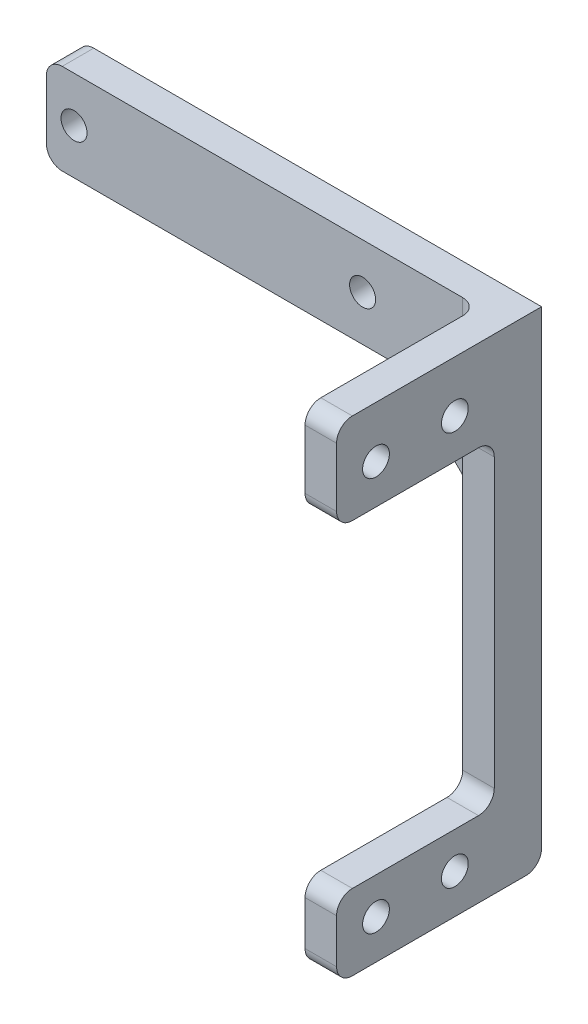
ISO-10303-21;
HEADER;
FILE_DESCRIPTION(('STEP AP214'),'2;1');
FILE_NAME('part.step','',(''),(''),'','','');
FILE_SCHEMA(('AUTOMOTIVE_DESIGN { 1 0 10303 214 1 1 1 1 }'));
ENDSEC;
DATA;
#1=APPLICATION_CONTEXT('core data for automotive mechanical design processes');
#2=APPLICATION_PROTOCOL_DEFINITION('international standard','automotive_design',2000,#1);
#3=PRODUCT_CONTEXT('',#1,'mechanical');
#4=PRODUCT('Part','Part','',(#3));
#5=PRODUCT_RELATED_PRODUCT_CATEGORY('part','',(#4));
#6=PRODUCT_DEFINITION_FORMATION('','',#4);
#7=PRODUCT_DEFINITION_CONTEXT('part definition',#1,'design');
#8=PRODUCT_DEFINITION('design','',#6,#7);
#9=PRODUCT_DEFINITION_SHAPE('','',#8);
#10=(LENGTH_UNIT() NAMED_UNIT(*) SI_UNIT(.MILLI.,.METRE.));
#11=(NAMED_UNIT(*) PLANE_ANGLE_UNIT() SI_UNIT($,.RADIAN.));
#12=(NAMED_UNIT(*) SI_UNIT($,.STERADIAN.) SOLID_ANGLE_UNIT());
#13=UNCERTAINTY_MEASURE_WITH_UNIT(LENGTH_MEASURE(1.E-05),#10,'distance_accuracy_value','');
#14=(GEOMETRIC_REPRESENTATION_CONTEXT(3) GLOBAL_UNCERTAINTY_ASSIGNED_CONTEXT((#13)) GLOBAL_UNIT_ASSIGNED_CONTEXT((#10,
#11,#12)) REPRESENTATION_CONTEXT('',''));
#15=CARTESIAN_POINT('',(0.,0.,0.));
#16=DIRECTION('',(0.,0.,1.));
#17=DIRECTION('',(1.,0.,0.));
#18=AXIS2_PLACEMENT_3D('',#15,#16,#17);
#19=CARTESIAN_POINT('',(54.8,11.5,4.));
#20=DIRECTION('',(1.,0.,0.));
#21=DIRECTION('',(0.,0.,-1.));
#22=AXIS2_PLACEMENT_3D('',#19,#20,#21);
#23=PLANE('',#22);
#24=CARTESIAN_POINT('',(54.8,5.,21.));
#25=DIRECTION('',(-1.,0.,0.));
#26=DIRECTION('',(0.,0.,1.));
#27=AXIS2_PLACEMENT_3D('',#24,#25,#26);
#28=CIRCLE('',#27,1.7);
#29=CARTESIAN_POINT('',(54.8,5.,22.7));
#30=VERTEX_POINT('',#29);
#31=EDGE_CURVE('E811',#30,#30,#28,.T.);
#32=ORIENTED_EDGE('',*,*,#31,.F.);
#33=EDGE_LOOP('',(#32));
#34=FACE_BOUND('',#33,.T.);
#35=CARTESIAN_POINT('',(54.8,5.,11.));
#36=DIRECTION('',(-1.,0.,0.));
#37=DIRECTION('',(0.,0.,1.));
#38=AXIS2_PLACEMENT_3D('',#35,#36,#37);
#39=CIRCLE('',#38,1.7);
#40=CARTESIAN_POINT('',(54.8,5.,12.7));
#41=VERTEX_POINT('',#40);
#42=EDGE_CURVE('E543',#41,#41,#39,.T.);
#43=ORIENTED_EDGE('',*,*,#42,.F.);
#44=EDGE_LOOP('',(#43));
#45=FACE_BOUND('',#44,.T.);
#46=DIRECTION('',(0.,0.,-1.));
#47=VECTOR('',#46,1.);
#48=CARTESIAN_POINT('',(54.8,0.,26.));
#49=LINE('',#48,#47);
#50=CARTESIAN_POINT('',(54.8,0.,24.));
#51=VERTEX_POINT('',#50);
#52=CARTESIAN_POINT('',(54.8,0.,8.));
#53=VERTEX_POINT('',#52);
#54=EDGE_CURVE('E437',#51,#53,#49,.T.);
#55=ORIENTED_EDGE('',*,*,#54,.F.);
#56=CARTESIAN_POINT('',(54.8,2.,24.));
#57=DIRECTION('',(1.,0.,0.));
#58=DIRECTION('',(0.,0.,-1.));
#59=AXIS2_PLACEMENT_3D('',#56,#57,#58);
#60=CIRCLE('',#59,2.);
#61=CARTESIAN_POINT('',(54.8,2.,26.));
#62=VERTEX_POINT('',#61);
#63=EDGE_CURVE('E290',#51,#62,#60,.F.);
#64=ORIENTED_EDGE('',*,*,#63,.T.);
#65=DIRECTION('',(0.,-1.,0.));
#66=VECTOR('',#65,1.);
#67=CARTESIAN_POINT('',(54.8,11.5,26.));
#68=LINE('',#67,#66);
#69=CARTESIAN_POINT('',(54.8,9.5,26.));
#70=VERTEX_POINT('',#69);
#71=EDGE_CURVE('E228',#70,#62,#68,.T.);
#72=ORIENTED_EDGE('',*,*,#71,.F.);
#73=CARTESIAN_POINT('',(54.8,9.5,24.));
#74=DIRECTION('',(1.,0.,0.));
#75=DIRECTION('',(0.,0.,-1.));
#76=AXIS2_PLACEMENT_3D('',#73,#74,#75);
#77=CIRCLE('',#76,2.);
#78=CARTESIAN_POINT('',(54.8,11.5,24.));
#79=VERTEX_POINT('',#78);
#80=EDGE_CURVE('E288',#70,#79,#77,.F.);
#81=ORIENTED_EDGE('',*,*,#80,.T.);
#82=DIRECTION('',(0.,0.,1.));
#83=VECTOR('',#82,1.);
#84=CARTESIAN_POINT('',(54.8,11.5,4.));
#85=LINE('',#84,#83);
#86=CARTESIAN_POINT('',(54.8,11.5,6.));
#87=VERTEX_POINT('',#86);
#88=EDGE_CURVE('E234',#87,#79,#85,.T.);
#89=ORIENTED_EDGE('',*,*,#88,.F.);
#90=DIRECTION('',(0.,-1.,0.));
#91=VECTOR('',#90,1.);
#92=CARTESIAN_POINT('',(54.8,-10.0000000000001,6.));
#93=LINE('',#92,#91);
#94=CARTESIAN_POINT('',(54.8,-2.,6.));
#95=VERTEX_POINT('',#94);
#96=EDGE_CURVE('E248',#87,#95,#93,.T.);
#97=ORIENTED_EDGE('',*,*,#96,.T.);
#98=CARTESIAN_POINT('',(54.8,-2.,8.));
#99=DIRECTION('',(1.,0.,0.));
#100=DIRECTION('',(0.,0.,-1.));
#101=AXIS2_PLACEMENT_3D('',#98,#99,#100);
#102=CIRCLE('',#101,2.);
#103=EDGE_CURVE('E340',#95,#53,#102,.T.);
#104=ORIENTED_EDGE('',*,*,#103,.T.);
#105=EDGE_LOOP('',(#55,#64,#72,#81,#89,#97,#104));
#106=FACE_BOUND('',#105,.T.);
#107=ADVANCED_FACE('F35',(#34,#45,#106),#23,.F.);
#108=CARTESIAN_POINT('',(58.8,11.5,26.));
#109=DIRECTION('',(0.,0.,1.));
#110=DIRECTION('',(1.,0.,0.));
#111=AXIS2_PLACEMENT_3D('',#108,#109,#110);
#112=PLANE('',#111);
#113=CARTESIAN_POINT('',(54.8,-42.4,26.));
#114=VERTEX_POINT('',#113);
#115=CARTESIAN_POINT('',(54.8,-48.,26.));
#116=VERTEX_POINT('',#115);
#117=EDGE_CURVE('E239',#114,#116,#68,.T.);
#118=ORIENTED_EDGE('',*,*,#117,.T.);
#119=DIRECTION('',(-1.,0.,0.));
#120=VECTOR('',#119,1.);
#121=CARTESIAN_POINT('',(58.8,-48.,26.));
#122=LINE('',#121,#120);
#123=CARTESIAN_POINT('',(58.8,-48.,26.));
#124=VERTEX_POINT('',#123);
#125=EDGE_CURVE('E271',#116,#124,#122,.F.);
#126=ORIENTED_EDGE('',*,*,#125,.T.);
#127=DIRECTION('',(0.,-1.,0.));
#128=VECTOR('',#127,1.);
#129=CARTESIAN_POINT('',(58.8,11.5,26.));
#130=LINE('',#129,#128);
#131=CARTESIAN_POINT('',(58.8,-42.4,26.));
#132=VERTEX_POINT('',#131);
#133=EDGE_CURVE('E236',#132,#124,#130,.T.);
#134=ORIENTED_EDGE('',*,*,#133,.F.);
#135=DIRECTION('',(-1.,0.,0.));
#136=VECTOR('',#135,1.);
#137=CARTESIAN_POINT('',(54.8,-42.4,26.));
#138=LINE('',#137,#136);
#139=EDGE_CURVE('E268',#132,#114,#138,.T.);
#140=ORIENTED_EDGE('',*,*,#139,.T.);
#141=EDGE_LOOP('',(#118,#126,#134,#140));
#142=FACE_BOUND('',#141,.T.);
#143=ADVANCED_FACE('F487',(#142),#112,.T.);
#144=CARTESIAN_POINT('',(0.,0.,0.));
#145=DIRECTION('',(0.,1.,0.));
#146=DIRECTION('',(0.,0.,1.));
#147=AXIS2_PLACEMENT_3D('',#144,#145,#146);
#148=PLANE('',#147);
#149=DIRECTION('',(1.,0.,0.));
#150=VECTOR('',#149,1.);
#151=CARTESIAN_POINT('',(0.,0.,0.));
#152=LINE('',#151,#150);
#153=CARTESIAN_POINT('',(2.,0.,0.));
#154=VERTEX_POINT('',#153);
#155=CARTESIAN_POINT('',(43.9715728752538,0.,0.));
#156=VERTEX_POINT('',#155);
#157=EDGE_CURVE('E219',#154,#156,#152,.T.);
#158=ORIENTED_EDGE('',*,*,#157,.T.);
#159=DIRECTION('',(0.,0.,-1.));
#160=VECTOR('',#159,1.);
#161=CARTESIAN_POINT('',(43.9715728752538,0.,4.));
#162=LINE('',#161,#160);
#163=CARTESIAN_POINT('',(43.9715728752538,0.,4.));
#164=VERTEX_POINT('',#163);
#165=EDGE_CURVE('E306',#156,#164,#162,.F.);
#166=ORIENTED_EDGE('',*,*,#165,.T.);
#167=DIRECTION('',(1.,0.,0.));
#168=VECTOR('',#167,1.);
#169=CARTESIAN_POINT('',(0.,0.,4.));
#170=LINE('',#169,#168);
#171=CARTESIAN_POINT('',(2.,0.,4.));
#172=VERTEX_POINT('',#171);
#173=EDGE_CURVE('E216',#172,#164,#170,.T.);
#174=ORIENTED_EDGE('',*,*,#173,.F.);
#175=DIRECTION('',(0.,0.,1.));
#176=VECTOR('',#175,1.);
#177=CARTESIAN_POINT('',(2.,0.,0.));
#178=LINE('',#177,#176);
#179=EDGE_CURVE('E304',#172,#154,#178,.F.);
#180=ORIENTED_EDGE('',*,*,#179,.T.);
#181=EDGE_LOOP('',(#158,#166,#174,#180));
#182=FACE_BOUND('',#181,.T.);
#183=ADVANCED_FACE('F387',(#182),#148,.F.);
#184=CARTESIAN_POINT('',(0.,11.5,4.));
#185=DIRECTION('',(0.,0.,-1.));
#186=DIRECTION('',(-1.,0.,0.));
#187=AXIS2_PLACEMENT_3D('',#184,#185,#186);
#188=PLANE('',#187);
#189=CARTESIAN_POINT('',(40.1,5.75,4.));
#190=DIRECTION('',(0.,0.,-1.));
#191=DIRECTION('',(-1.,0.,0.));
#192=AXIS2_PLACEMENT_3D('',#189,#190,#191);
#193=CIRCLE('',#192,1.65);
#194=CARTESIAN_POINT('',(38.45,5.75,4.));
#195=VERTEX_POINT('',#194);
#196=EDGE_CURVE('E373',#195,#195,#193,.F.);
#197=ORIENTED_EDGE('',*,*,#196,.F.);
#198=EDGE_LOOP('',(#197));
#199=FACE_BOUND('',#198,.T.);
#200=CARTESIAN_POINT('',(3.5,5.75,4.));
#201=DIRECTION('',(0.,0.,-1.));
#202=DIRECTION('',(-1.,0.,0.));
#203=AXIS2_PLACEMENT_3D('',#200,#201,#202);
#204=CIRCLE('',#203,1.65);
#205=CARTESIAN_POINT('',(1.85,5.75,4.));
#206=VERTEX_POINT('',#205);
#207=EDGE_CURVE('E222',#206,#206,#204,.F.);
#208=ORIENTED_EDGE('',*,*,#207,.F.);
#209=EDGE_LOOP('',(#208));
#210=FACE_BOUND('',#209,.T.);
#211=DIRECTION('',(1.,0.,0.));
#212=VECTOR('',#211,1.);
#213=CARTESIAN_POINT('',(0.,11.5,4.));
#214=LINE('',#213,#212);
#215=CARTESIAN_POINT('',(2.,11.5,4.));
#216=VERTEX_POINT('',#215);
#217=CARTESIAN_POINT('',(52.8,11.5,4.));
#218=VERTEX_POINT('',#217);
#219=EDGE_CURVE('E203',#216,#218,#214,.T.);
#220=ORIENTED_EDGE('',*,*,#219,.F.);
#221=CARTESIAN_POINT('',(2.,9.5,4.));
#222=DIRECTION('',(0.,0.,-1.));
#223=DIRECTION('',(-1.,0.,0.));
#224=AXIS2_PLACEMENT_3D('',#221,#222,#223);
#225=CIRCLE('',#224,2.);
#226=CARTESIAN_POINT('',(0.,9.5,4.));
#227=VERTEX_POINT('',#226);
#228=EDGE_CURVE('E311',#216,#227,#225,.F.);
#229=ORIENTED_EDGE('',*,*,#228,.T.);
#230=DIRECTION('',(0.,-1.,0.));
#231=VECTOR('',#230,1.);
#232=CARTESIAN_POINT('',(0.,11.5,4.));
#233=LINE('',#232,#231);
#234=CARTESIAN_POINT('',(0.,2.,4.));
#235=VERTEX_POINT('',#234);
#236=EDGE_CURVE('E226',#227,#235,#233,.T.);
#237=ORIENTED_EDGE('',*,*,#236,.T.);
#238=CARTESIAN_POINT('',(2.,2.,4.));
#239=DIRECTION('',(0.,0.,-1.));
#240=DIRECTION('',(-1.,0.,0.));
#241=AXIS2_PLACEMENT_3D('',#238,#239,#240);
#242=CIRCLE('',#241,2.);
#243=EDGE_CURVE('E309',#235,#172,#242,.F.);
#244=ORIENTED_EDGE('',*,*,#243,.T.);
#245=ORIENTED_EDGE('',*,*,#173,.T.);
#246=CARTESIAN_POINT('',(43.9715728752538,-2.,4.));
#247=DIRECTION('',(0.,0.,-1.));
#248=DIRECTION('',(-1.,0.,0.));
#249=AXIS2_PLACEMENT_3D('',#246,#247,#248);
#250=CIRCLE('',#249,2.);
#251=CARTESIAN_POINT('',(45.385786437627,-0.585786437626915,4.));
#252=VERTEX_POINT('',#251);
#253=EDGE_CURVE('E326',#164,#252,#250,.T.);
#254=ORIENTED_EDGE('',*,*,#253,.T.);
#255=DIRECTION('',(-0.707106781186544,0.707106781186551,0.));
#256=VECTOR('',#255,1.);
#257=CARTESIAN_POINT('',(16.6500000000003,28.1500000000001,4.));
#258=LINE('',#257,#256);
#259=CARTESIAN_POINT('',(52.8,-8.00000000000004,4.));
#260=VERTEX_POINT('',#259);
#261=EDGE_CURVE('E245',#252,#260,#258,.F.);
#262=ORIENTED_EDGE('',*,*,#261,.T.);
#263=DIRECTION('',(0.,-1.,0.));
#264=VECTOR('',#263,1.);
#265=CARTESIAN_POINT('',(52.8,11.5,4.));
#266=LINE('',#265,#264);
#267=EDGE_CURVE('E250',#260,#218,#266,.F.);
#268=ORIENTED_EDGE('',*,*,#267,.T.);
#269=EDGE_LOOP('',(#220,#229,#237,#244,#245,#254,#262,#268));
#270=FACE_BOUND('',#269,.T.);
#271=ADVANCED_FACE('F384',(#199,#210,#270),#188,.F.);
#272=CARTESIAN_POINT('',(58.8,11.5,0.));
#273=DIRECTION('',(1.,0.,0.));
#274=DIRECTION('',(0.,0.,-1.));
#275=AXIS2_PLACEMENT_3D('',#272,#273,#274);
#276=PLANE('',#275);
#277=CARTESIAN_POINT('',(58.8,5.,11.));
#278=DIRECTION('',(1.,0.,0.));
#279=DIRECTION('',(0.,0.,-1.));
#280=AXIS2_PLACEMENT_3D('',#277,#278,#279);
#281=CIRCLE('',#280,1.7);
#282=CARTESIAN_POINT('',(58.8,5.,9.3));
#283=VERTEX_POINT('',#282);
#284=EDGE_CURVE('E525',#283,#283,#281,.F.);
#285=ORIENTED_EDGE('',*,*,#284,.T.);
#286=EDGE_LOOP('',(#285));
#287=FACE_BOUND('',#286,.T.);
#288=CARTESIAN_POINT('',(58.8,5.,21.));
#289=DIRECTION('',(1.,0.,0.));
#290=DIRECTION('',(0.,0.,-1.));
#291=AXIS2_PLACEMENT_3D('',#288,#289,#290);
#292=CIRCLE('',#291,1.7);
#293=CARTESIAN_POINT('',(58.8,5.,19.3));
#294=VERTEX_POINT('',#293);
#295=EDGE_CURVE('E529',#294,#294,#292,.F.);
#296=ORIENTED_EDGE('',*,*,#295,.T.);
#297=EDGE_LOOP('',(#296));
#298=FACE_BOUND('',#297,.T.);
#299=CARTESIAN_POINT('',(58.8,-45.,21.0000000000005));
#300=DIRECTION('',(1.,0.,0.));
#301=DIRECTION('',(0.,0.,-1.));
#302=AXIS2_PLACEMENT_3D('',#299,#300,#301);
#303=CIRCLE('',#302,1.7);
#304=CARTESIAN_POINT('',(58.8,-45.,19.3000000000005));
#305=VERTEX_POINT('',#304);
#306=EDGE_CURVE('E533',#305,#305,#303,.F.);
#307=ORIENTED_EDGE('',*,*,#306,.T.);
#308=EDGE_LOOP('',(#307));
#309=FACE_BOUND('',#308,.T.);
#310=CARTESIAN_POINT('',(58.8,-45.,11.0000000000005));
#311=DIRECTION('',(1.,0.,0.));
#312=DIRECTION('',(0.,0.,-1.));
#313=AXIS2_PLACEMENT_3D('',#310,#311,#312);
#314=CIRCLE('',#313,1.7);
#315=CARTESIAN_POINT('',(58.8,-45.,9.30000000000052));
#316=VERTEX_POINT('',#315);
#317=EDGE_CURVE('E536',#316,#316,#314,.F.);
#318=ORIENTED_EDGE('',*,*,#317,.T.);
#319=EDGE_LOOP('',(#318));
#320=FACE_BOUND('',#319,.T.);
#321=DIRECTION('',(0.,0.,1.));
#322=VECTOR('',#321,1.);
#323=CARTESIAN_POINT('',(58.8,-50.,26.));
#324=LINE('',#323,#322);
#325=CARTESIAN_POINT('',(58.8,-50.,2.00000000000001));
#326=VERTEX_POINT('',#325);
#327=CARTESIAN_POINT('',(58.8,-50.,24.));
#328=VERTEX_POINT('',#327);
#329=EDGE_CURVE('E355',#326,#328,#324,.T.);
#330=ORIENTED_EDGE('',*,*,#329,.F.);
#331=CARTESIAN_POINT('',(58.8,-48.,2.));
#332=DIRECTION('',(1.,0.,0.));
#333=DIRECTION('',(0.,0.,-1.));
#334=AXIS2_PLACEMENT_3D('',#331,#332,#333);
#335=CIRCLE('',#334,2.);
#336=CARTESIAN_POINT('',(58.8,-48.,0.));
#337=VERTEX_POINT('',#336);
#338=EDGE_CURVE('E57',#326,#337,#335,.T.);
#339=ORIENTED_EDGE('',*,*,#338,.T.);
#340=DIRECTION('',(0.,-1.,0.));
#341=VECTOR('',#340,1.);
#342=CARTESIAN_POINT('',(58.8,11.5,0.));
#343=LINE('',#342,#341);
#344=CARTESIAN_POINT('',(58.8,11.5,0.));
#345=VERTEX_POINT('',#344);
#346=EDGE_CURVE('E195',#345,#337,#343,.T.);
#347=ORIENTED_EDGE('',*,*,#346,.F.);
#348=DIRECTION('',(0.,0.,1.));
#349=VECTOR('',#348,1.);
#350=CARTESIAN_POINT('',(58.8,11.5,0.));
#351=LINE('',#350,#349);
#352=CARTESIAN_POINT('',(58.8,11.5,24.));
#353=VERTEX_POINT('',#352);
#354=EDGE_CURVE('E204',#345,#353,#351,.T.);
#355=ORIENTED_EDGE('',*,*,#354,.T.);
#356=CARTESIAN_POINT('',(58.8,9.5,24.));
#357=DIRECTION('',(1.,0.,0.));
#358=DIRECTION('',(0.,0.,-1.));
#359=AXIS2_PLACEMENT_3D('',#356,#357,#358);
#360=CIRCLE('',#359,2.);
#361=CARTESIAN_POINT('',(58.8,9.5,26.));
#362=VERTEX_POINT('',#361);
#363=EDGE_CURVE('E273',#353,#362,#360,.T.);
#364=ORIENTED_EDGE('',*,*,#363,.T.);
#365=CARTESIAN_POINT('',(58.8,2.,26.));
#366=VERTEX_POINT('',#365);
#367=EDGE_CURVE('E240',#362,#366,#130,.T.);
#368=ORIENTED_EDGE('',*,*,#367,.T.);
#369=CARTESIAN_POINT('',(58.8,2.,24.));
#370=DIRECTION('',(1.,0.,0.));
#371=DIRECTION('',(0.,0.,-1.));
#372=AXIS2_PLACEMENT_3D('',#369,#370,#371);
#373=CIRCLE('',#372,2.);
#374=CARTESIAN_POINT('',(58.8,0.,24.));
#375=VERTEX_POINT('',#374);
#376=EDGE_CURVE('E275',#366,#375,#373,.T.);
#377=ORIENTED_EDGE('',*,*,#376,.T.);
#378=DIRECTION('',(0.,0.,-1.));
#379=VECTOR('',#378,1.);
#380=CARTESIAN_POINT('',(58.8,0.,26.));
#381=LINE('',#380,#379);
#382=CARTESIAN_POINT('',(58.8,0.,8.));
#383=VERTEX_POINT('',#382);
#384=EDGE_CURVE('E367',#375,#383,#381,.T.);
#385=ORIENTED_EDGE('',*,*,#384,.T.);
#386=CARTESIAN_POINT('',(58.8,-2.,8.));
#387=DIRECTION('',(1.,0.,0.));
#388=DIRECTION('',(0.,0.,-1.));
#389=AXIS2_PLACEMENT_3D('',#386,#387,#388);
#390=CIRCLE('',#389,2.);
#391=CARTESIAN_POINT('',(58.8,-2.,6.));
#392=VERTEX_POINT('',#391);
#393=EDGE_CURVE('E342',#383,#392,#390,.F.);
#394=ORIENTED_EDGE('',*,*,#393,.T.);
#395=DIRECTION('',(0.,-1.,0.));
#396=VECTOR('',#395,1.);
#397=CARTESIAN_POINT('',(58.8,0.,6.));
#398=LINE('',#397,#396);
#399=CARTESIAN_POINT('',(58.8,-38.4,6.));
#400=VERTEX_POINT('',#399);
#401=EDGE_CURVE('E459',#392,#400,#398,.T.);
#402=ORIENTED_EDGE('',*,*,#401,.T.);
#403=CARTESIAN_POINT('',(58.8,-38.4,8.));
#404=DIRECTION('',(1.,0.,0.));
#405=DIRECTION('',(0.,0.,-1.));
#406=AXIS2_PLACEMENT_3D('',#403,#404,#405);
#407=CIRCLE('',#406,2.);
#408=CARTESIAN_POINT('',(58.8,-40.4,8.));
#409=VERTEX_POINT('',#408);
#410=EDGE_CURVE('E346',#400,#409,#407,.F.);
#411=ORIENTED_EDGE('',*,*,#410,.T.);
#412=DIRECTION('',(0.,0.,1.));
#413=VECTOR('',#412,1.);
#414=CARTESIAN_POINT('',(58.8,-40.4,26.));
#415=LINE('',#414,#413);
#416=CARTESIAN_POINT('',(58.8,-40.4,24.));
#417=VERTEX_POINT('',#416);
#418=EDGE_CURVE('E441',#409,#417,#415,.T.);
#419=ORIENTED_EDGE('',*,*,#418,.T.);
#420=CARTESIAN_POINT('',(58.8,-42.4,24.));
#421=DIRECTION('',(1.,0.,0.));
#422=DIRECTION('',(0.,0.,-1.));
#423=AXIS2_PLACEMENT_3D('',#420,#421,#422);
#424=CIRCLE('',#423,2.);
#425=EDGE_CURVE('E277',#417,#132,#424,.T.);
#426=ORIENTED_EDGE('',*,*,#425,.T.);
#427=ORIENTED_EDGE('',*,*,#133,.T.);
#428=CARTESIAN_POINT('',(58.8,-48.,24.));
#429=DIRECTION('',(1.,0.,0.));
#430=DIRECTION('',(0.,0.,-1.));
#431=AXIS2_PLACEMENT_3D('',#428,#429,#430);
#432=CIRCLE('',#431,2.);
#433=EDGE_CURVE('E279',#124,#328,#432,.T.);
#434=ORIENTED_EDGE('',*,*,#433,.T.);
#435=EDGE_LOOP('',(#330,#339,#347,#355,#364,#368,#377,#385,#394,#402,#411,#419,#426,#427,#434));
#436=FACE_BOUND('',#435,.T.);
#437=ADVANCED_FACE('F207',(#287,#298,#309,#320,#436),#276,.T.);
#438=CARTESIAN_POINT('',(0.,11.5,0.));
#439=DIRECTION('',(0.,0.,-1.));
#440=DIRECTION('',(-1.,0.,0.));
#441=AXIS2_PLACEMENT_3D('',#438,#439,#440);
#442=PLANE('',#441);
#443=CARTESIAN_POINT('',(40.1,5.75,0.));
#444=DIRECTION('',(0.,0.,-1.));
#445=DIRECTION('',(-1.,0.,0.));
#446=AXIS2_PLACEMENT_3D('',#443,#444,#445);
#447=CIRCLE('',#446,1.65);
#448=CARTESIAN_POINT('',(38.45,5.75,0.));
#449=VERTEX_POINT('',#448);
#450=EDGE_CURVE('E365',#449,#449,#447,.T.);
#451=ORIENTED_EDGE('',*,*,#450,.F.);
#452=EDGE_LOOP('',(#451));
#453=FACE_BOUND('',#452,.T.);
#454=CARTESIAN_POINT('',(3.5,5.75,0.));
#455=DIRECTION('',(0.,0.,-1.));
#456=DIRECTION('',(-1.,0.,0.));
#457=AXIS2_PLACEMENT_3D('',#454,#455,#456);
#458=CIRCLE('',#457,1.65);
#459=CARTESIAN_POINT('',(1.85,5.75,0.));
#460=VERTEX_POINT('',#459);
#461=EDGE_CURVE('E375',#460,#460,#458,.T.);
#462=ORIENTED_EDGE('',*,*,#461,.F.);
#463=EDGE_LOOP('',(#462));
#464=FACE_BOUND('',#463,.T.);
#465=ORIENTED_EDGE('',*,*,#346,.T.);
#466=DIRECTION('',(1.,0.,0.));
#467=VECTOR('',#466,1.);
#468=CARTESIAN_POINT('',(0.,-48.,0.));
#469=LINE('',#468,#467);
#470=CARTESIAN_POINT('',(54.8,-48.,0.));
#471=VERTEX_POINT('',#470);
#472=EDGE_CURVE('E43',#337,#471,#469,.F.);
#473=ORIENTED_EDGE('',*,*,#472,.T.);
#474=DIRECTION('',(0.,1.,0.));
#475=VECTOR('',#474,1.);
#476=CARTESIAN_POINT('',(54.8,-50.,0.));
#477=LINE('',#476,#475);
#478=CARTESIAN_POINT('',(54.8,-10.8284271247463,0.));
#479=VERTEX_POINT('',#478);
#480=EDGE_CURVE('E363',#471,#479,#477,.T.);
#481=ORIENTED_EDGE('',*,*,#480,.T.);
#482=CARTESIAN_POINT('',(52.8,-10.8284271247463,0.));
#483=DIRECTION('',(0.,0.,-1.));
#484=DIRECTION('',(-1.,0.,0.));
#485=AXIS2_PLACEMENT_3D('',#482,#483,#484);
#486=CIRCLE('',#485,2.);
#487=CARTESIAN_POINT('',(54.2142135623731,-9.41421356237316,0.));
#488=VERTEX_POINT('',#487);
#489=EDGE_CURVE('E321',#479,#488,#486,.F.);
#490=ORIENTED_EDGE('',*,*,#489,.T.);
#491=DIRECTION('',(0.707106781186544,-0.707106781186551,0.));
#492=VECTOR('',#491,1.);
#493=CARTESIAN_POINT('',(54.8,-10.0000000000001,0.));
#494=LINE('',#493,#492);
#495=CARTESIAN_POINT('',(45.385786437627,-0.585786437626912,0.));
#496=VERTEX_POINT('',#495);
#497=EDGE_CURVE('E209',#488,#496,#494,.F.);
#498=ORIENTED_EDGE('',*,*,#497,.T.);
#499=CARTESIAN_POINT('',(43.9715728752538,-2.,0.));
#500=DIRECTION('',(0.,0.,-1.));
#501=DIRECTION('',(-1.,0.,0.));
#502=AXIS2_PLACEMENT_3D('',#499,#500,#501);
#503=CIRCLE('',#502,2.);
#504=EDGE_CURVE('E328',#496,#156,#503,.F.);
#505=ORIENTED_EDGE('',*,*,#504,.T.);
#506=ORIENTED_EDGE('',*,*,#157,.F.);
#507=CARTESIAN_POINT('',(2.,2.,0.));
#508=DIRECTION('',(0.,0.,-1.));
#509=DIRECTION('',(-1.,0.,0.));
#510=AXIS2_PLACEMENT_3D('',#507,#508,#509);
#511=CIRCLE('',#510,2.);
#512=CARTESIAN_POINT('',(0.,2.,0.));
#513=VERTEX_POINT('',#512);
#514=EDGE_CURVE('E318',#154,#513,#511,.T.);
#515=ORIENTED_EDGE('',*,*,#514,.T.);
#516=DIRECTION('',(0.,-1.,0.));
#517=VECTOR('',#516,1.);
#518=CARTESIAN_POINT('',(0.,11.5,0.));
#519=LINE('',#518,#517);
#520=CARTESIAN_POINT('',(0.,9.5,0.));
#521=VERTEX_POINT('',#520);
#522=EDGE_CURVE('E210',#521,#513,#519,.T.);
#523=ORIENTED_EDGE('',*,*,#522,.F.);
#524=CARTESIAN_POINT('',(2.,9.5,0.));
#525=DIRECTION('',(0.,0.,-1.));
#526=DIRECTION('',(-1.,0.,0.));
#527=AXIS2_PLACEMENT_3D('',#524,#525,#526);
#528=CIRCLE('',#527,2.);
#529=CARTESIAN_POINT('',(2.,11.5,0.));
#530=VERTEX_POINT('',#529);
#531=EDGE_CURVE('E198',#521,#530,#528,.T.);
#532=ORIENTED_EDGE('',*,*,#531,.T.);
#533=DIRECTION('',(1.,0.,0.));
#534=VECTOR('',#533,1.);
#535=CARTESIAN_POINT('',(0.,11.5,0.));
#536=LINE('',#535,#534);
#537=EDGE_CURVE('E193',#530,#345,#536,.T.);
#538=ORIENTED_EDGE('',*,*,#537,.T.);
#539=EDGE_LOOP('',(#465,#473,#481,#490,#498,#505,#506,#515,#523,#532,#538));
#540=FACE_BOUND('',#539,.T.);
#541=ADVANCED_FACE('F194',(#453,#464,#540),#442,.T.);
#542=CARTESIAN_POINT('',(0.,11.5,0.));
#543=DIRECTION('',(1.,0.,0.));
#544=DIRECTION('',(0.,0.,-1.));
#545=AXIS2_PLACEMENT_3D('',#542,#543,#544);
#546=PLANE('',#545);
#547=ORIENTED_EDGE('',*,*,#236,.F.);
#548=DIRECTION('',(0.,0.,1.));
#549=VECTOR('',#548,1.);
#550=CARTESIAN_POINT('',(0.,9.5,0.));
#551=LINE('',#550,#549);
#552=EDGE_CURVE('E316',#227,#521,#551,.F.);
#553=ORIENTED_EDGE('',*,*,#552,.T.);
#554=ORIENTED_EDGE('',*,*,#522,.T.);
#555=DIRECTION('',(0.,0.,1.));
#556=VECTOR('',#555,1.);
#557=CARTESIAN_POINT('',(0.,2.,0.));
#558=LINE('',#557,#556);
#559=EDGE_CURVE('E313',#513,#235,#558,.T.);
#560=ORIENTED_EDGE('',*,*,#559,.T.);
#561=EDGE_LOOP('',(#547,#553,#554,#560));
#562=FACE_BOUND('',#561,.T.);
#563=ADVANCED_FACE('F400',(#562),#546,.F.);
#564=CARTESIAN_POINT('',(0.,11.5,0.));
#565=DIRECTION('',(0.,1.,0.));
#566=DIRECTION('',(0.,0.,1.));
#567=AXIS2_PLACEMENT_3D('',#564,#565,#566);
#568=PLANE('',#567);
#569=ORIENTED_EDGE('',*,*,#88,.T.);
#570=DIRECTION('',(-1.,0.,0.));
#571=VECTOR('',#570,1.);
#572=CARTESIAN_POINT('',(0.,11.5,24.));
#573=LINE('',#572,#571);
#574=EDGE_CURVE('E215',#79,#353,#573,.F.);
#575=ORIENTED_EDGE('',*,*,#574,.T.);
#576=ORIENTED_EDGE('',*,*,#354,.F.);
#577=ORIENTED_EDGE('',*,*,#537,.F.);
#578=DIRECTION('',(0.,0.,1.));
#579=VECTOR('',#578,1.);
#580=CARTESIAN_POINT('',(2.,11.5,4.));
#581=LINE('',#580,#579);
#582=EDGE_CURVE('E297',#530,#216,#581,.T.);
#583=ORIENTED_EDGE('',*,*,#582,.T.);
#584=ORIENTED_EDGE('',*,*,#219,.T.);
#585=CARTESIAN_POINT('',(52.8,11.5,6.));
#586=DIRECTION('',(0.,1.,0.));
#587=DIRECTION('',(0.,0.,1.));
#588=AXIS2_PLACEMENT_3D('',#585,#586,#587);
#589=CIRCLE('',#588,2.);
#590=EDGE_CURVE('E255',#218,#87,#589,.F.);
#591=ORIENTED_EDGE('',*,*,#590,.T.);
#592=EDGE_LOOP('',(#569,#575,#576,#577,#583,#584,#591));
#593=FACE_BOUND('',#592,.T.);
#594=ADVANCED_FACE('F213',(#593),#568,.T.);
#595=ORIENTED_EDGE('',*,*,#71,.T.);
#596=DIRECTION('',(-1.,0.,0.));
#597=VECTOR('',#596,1.);
#598=CARTESIAN_POINT('',(58.8,2.,26.));
#599=LINE('',#598,#597);
#600=EDGE_CURVE('E295',#62,#366,#599,.F.);
#601=ORIENTED_EDGE('',*,*,#600,.T.);
#602=ORIENTED_EDGE('',*,*,#367,.F.);
#603=DIRECTION('',(-1.,0.,0.));
#604=VECTOR('',#603,1.);
#605=CARTESIAN_POINT('',(58.8,9.5,26.));
#606=LINE('',#605,#604);
#607=EDGE_CURVE('E292',#362,#70,#606,.T.);
#608=ORIENTED_EDGE('',*,*,#607,.T.);
#609=EDGE_LOOP('',(#595,#601,#602,#608));
#610=FACE_BOUND('',#609,.T.);
#611=ADVANCED_FACE('F390',(#610),#112,.T.);
#612=CARTESIAN_POINT('',(54.8,-45.,21.0000000000005));
#613=DIRECTION('',(-1.,0.,0.));
#614=DIRECTION('',(0.,0.,1.));
#615=AXIS2_PLACEMENT_3D('',#612,#613,#614);
#616=CIRCLE('',#615,1.7);
#617=CARTESIAN_POINT('',(54.8,-45.,22.7000000000005));
#618=VERTEX_POINT('',#617);
#619=EDGE_CURVE('E809',#618,#618,#616,.T.);
#620=ORIENTED_EDGE('',*,*,#619,.F.);
#621=EDGE_LOOP('',(#620));
#622=FACE_BOUND('',#621,.T.);
#623=CARTESIAN_POINT('',(54.8,-45.,11.0000000000005));
#624=DIRECTION('',(-1.,0.,0.));
#625=DIRECTION('',(0.,0.,1.));
#626=AXIS2_PLACEMENT_3D('',#623,#624,#625);
#627=CIRCLE('',#626,1.7);
#628=CARTESIAN_POINT('',(54.8,-45.,12.7000000000005));
#629=VERTEX_POINT('',#628);
#630=EDGE_CURVE('E537',#629,#629,#627,.T.);
#631=ORIENTED_EDGE('',*,*,#630,.F.);
#632=EDGE_LOOP('',(#631));
#633=FACE_BOUND('',#632,.T.);
#634=ORIENTED_EDGE('',*,*,#480,.F.);
#635=CARTESIAN_POINT('',(54.8,-48.,2.));
#636=DIRECTION('',(1.,0.,0.));
#637=DIRECTION('',(0.,0.,-1.));
#638=AXIS2_PLACEMENT_3D('',#635,#636,#637);
#639=CIRCLE('',#638,2.);
#640=CARTESIAN_POINT('',(54.8,-50.,2.00000000000001));
#641=VERTEX_POINT('',#640);
#642=EDGE_CURVE('E11',#471,#641,#639,.F.);
#643=ORIENTED_EDGE('',*,*,#642,.T.);
#644=DIRECTION('',(0.,0.,-1.));
#645=VECTOR('',#644,1.);
#646=CARTESIAN_POINT('',(54.8,-50.,26.));
#647=LINE('',#646,#645);
#648=CARTESIAN_POINT('',(54.8,-50.,24.));
#649=VERTEX_POINT('',#648);
#650=EDGE_CURVE('E357',#649,#641,#647,.T.);
#651=ORIENTED_EDGE('',*,*,#650,.F.);
#652=CARTESIAN_POINT('',(54.8,-48.,24.));
#653=DIRECTION('',(1.,0.,0.));
#654=DIRECTION('',(0.,0.,-1.));
#655=AXIS2_PLACEMENT_3D('',#652,#653,#654);
#656=CIRCLE('',#655,2.);
#657=EDGE_CURVE('E266',#649,#116,#656,.F.);
#658=ORIENTED_EDGE('',*,*,#657,.T.);
#659=ORIENTED_EDGE('',*,*,#117,.F.);
#660=CARTESIAN_POINT('',(54.8,-42.4,24.));
#661=DIRECTION('',(1.,0.,0.));
#662=DIRECTION('',(0.,0.,-1.));
#663=AXIS2_PLACEMENT_3D('',#660,#661,#662);
#664=CIRCLE('',#663,2.);
#665=CARTESIAN_POINT('',(54.8,-40.4,24.));
#666=VERTEX_POINT('',#665);
#667=EDGE_CURVE('E263',#114,#666,#664,.F.);
#668=ORIENTED_EDGE('',*,*,#667,.T.);
#669=DIRECTION('',(0.,0.,1.));
#670=VECTOR('',#669,1.);
#671=CARTESIAN_POINT('',(54.8,-40.4,26.));
#672=LINE('',#671,#670);
#673=CARTESIAN_POINT('',(54.8,-40.4,8.));
#674=VERTEX_POINT('',#673);
#675=EDGE_CURVE('E439',#674,#666,#672,.T.);
#676=ORIENTED_EDGE('',*,*,#675,.F.);
#677=CARTESIAN_POINT('',(54.8,-38.4,8.));
#678=DIRECTION('',(1.,0.,0.));
#679=DIRECTION('',(0.,0.,-1.));
#680=AXIS2_PLACEMENT_3D('',#677,#678,#679);
#681=CIRCLE('',#680,2.);
#682=CARTESIAN_POINT('',(54.8,-38.4,6.));
#683=VERTEX_POINT('',#682);
#684=EDGE_CURVE('E344',#674,#683,#681,.T.);
#685=ORIENTED_EDGE('',*,*,#684,.T.);
#686=DIRECTION('',(0.,-1.,0.));
#687=VECTOR('',#686,1.);
#688=CARTESIAN_POINT('',(54.8,0.,6.));
#689=LINE('',#688,#687);
#690=CARTESIAN_POINT('',(54.8,-10.8284271247463,6.));
#691=VERTEX_POINT('',#690);
#692=EDGE_CURVE('E432',#691,#683,#689,.T.);
#693=ORIENTED_EDGE('',*,*,#692,.F.);
#694=DIRECTION('',(0.,0.,1.));
#695=VECTOR('',#694,1.);
#696=CARTESIAN_POINT('',(54.8,-10.8284271247463,0.));
#697=LINE('',#696,#695);
#698=EDGE_CURVE('E260',#691,#479,#697,.F.);
#699=ORIENTED_EDGE('',*,*,#698,.T.);
#700=EDGE_LOOP('',(#634,#643,#651,#658,#659,#668,#676,#685,#693,#699));
#701=FACE_BOUND('',#700,.T.);
#702=ADVANCED_FACE('F430',(#622,#633,#701),#23,.F.);
#703=CARTESIAN_POINT('',(3.5,5.75,26.001));
#704=DIRECTION('',(0.,0.,-1.));
#705=DIRECTION('',(-1.,0.,0.));
#706=AXIS2_PLACEMENT_3D('',#703,#704,#705);
#707=CYLINDRICAL_SURFACE('',#706,1.65);
#708=ORIENTED_EDGE('',*,*,#461,.T.);
#709=EDGE_LOOP('',(#708));
#710=FACE_BOUND('',#709,.T.);
#711=ORIENTED_EDGE('',*,*,#207,.T.);
#712=EDGE_LOOP('',(#711));
#713=FACE_BOUND('',#712,.T.);
#714=ADVANCED_FACE('F382',(#710,#713),#707,.F.);
#715=CARTESIAN_POINT('',(40.1,5.75,26.001));
#716=DIRECTION('',(0.,0.,-1.));
#717=DIRECTION('',(-1.,0.,0.));
#718=AXIS2_PLACEMENT_3D('',#715,#716,#717);
#719=CYLINDRICAL_SURFACE('',#718,1.65);
#720=ORIENTED_EDGE('',*,*,#450,.T.);
#721=EDGE_LOOP('',(#720));
#722=FACE_BOUND('',#721,.T.);
#723=ORIENTED_EDGE('',*,*,#196,.T.);
#724=EDGE_LOOP('',(#723));
#725=FACE_BOUND('',#724,.T.);
#726=ADVANCED_FACE('F504',(#722,#725),#719,.F.);
#727=CARTESIAN_POINT('',(0.,-50.,0.));
#728=DIRECTION('',(0.,-1.,0.));
#729=DIRECTION('',(0.,0.,-1.));
#730=AXIS2_PLACEMENT_3D('',#727,#728,#729);
#731=PLANE('',#730);
#732=ORIENTED_EDGE('',*,*,#650,.T.);
#733=DIRECTION('',(1.,0.,0.));
#734=VECTOR('',#733,1.);
#735=CARTESIAN_POINT('',(0.,-50.,2.));
#736=LINE('',#735,#734);
#737=EDGE_CURVE('E348',#641,#326,#736,.T.);
#738=ORIENTED_EDGE('',*,*,#737,.T.);
#739=ORIENTED_EDGE('',*,*,#329,.T.);
#740=DIRECTION('',(-1.,0.,0.));
#741=VECTOR('',#740,1.);
#742=CARTESIAN_POINT('',(0.,-50.,24.));
#743=LINE('',#742,#741);
#744=EDGE_CURVE('E257',#328,#649,#743,.T.);
#745=ORIENTED_EDGE('',*,*,#744,.T.);
#746=EDGE_LOOP('',(#732,#738,#739,#745));
#747=FACE_BOUND('',#746,.T.);
#748=ADVANCED_FACE('F354',(#747),#731,.T.);
#749=CARTESIAN_POINT('',(58.801,-40.4,26.));
#750=DIRECTION('',(0.,-1.,0.));
#751=DIRECTION('',(0.,0.,-1.));
#752=AXIS2_PLACEMENT_3D('',#749,#750,#751);
#753=PLANE('',#752);
#754=ORIENTED_EDGE('',*,*,#418,.F.);
#755=DIRECTION('',(-1.,0.,0.));
#756=VECTOR('',#755,1.);
#757=CARTESIAN_POINT('',(54.8,-40.4,8.));
#758=LINE('',#757,#756);
#759=EDGE_CURVE('E337',#409,#674,#758,.T.);
#760=ORIENTED_EDGE('',*,*,#759,.T.);
#761=ORIENTED_EDGE('',*,*,#675,.T.);
#762=DIRECTION('',(-1.,0.,0.));
#763=VECTOR('',#762,1.);
#764=CARTESIAN_POINT('',(58.8,-40.4,24.));
#765=LINE('',#764,#763);
#766=EDGE_CURVE('E282',#666,#417,#765,.F.);
#767=ORIENTED_EDGE('',*,*,#766,.T.);
#768=EDGE_LOOP('',(#754,#760,#761,#767));
#769=FACE_BOUND('',#768,.T.);
#770=ADVANCED_FACE('F483',(#769),#753,.F.);
#771=CARTESIAN_POINT('',(58.801,0.,6.));
#772=DIRECTION('',(0.,0.,-1.));
#773=DIRECTION('',(0.,1.,0.));
#774=AXIS2_PLACEMENT_3D('',#771,#772,#773);
#775=PLANE('',#774);
#776=ORIENTED_EDGE('',*,*,#401,.F.);
#777=DIRECTION('',(-1.,0.,0.));
#778=VECTOR('',#777,1.);
#779=CARTESIAN_POINT('',(54.8,-2.,6.));
#780=LINE('',#779,#778);
#781=EDGE_CURVE('E332',#392,#95,#780,.T.);
#782=ORIENTED_EDGE('',*,*,#781,.T.);
#783=EDGE_CURVE('E436',#95,#691,#689,.T.);
#784=ORIENTED_EDGE('',*,*,#783,.T.);
#785=ORIENTED_EDGE('',*,*,#692,.T.);
#786=DIRECTION('',(-1.,0.,0.));
#787=VECTOR('',#786,1.);
#788=CARTESIAN_POINT('',(58.8,-38.4,6.));
#789=LINE('',#788,#787);
#790=EDGE_CURVE('E330',#683,#400,#789,.F.);
#791=ORIENTED_EDGE('',*,*,#790,.T.);
#792=EDGE_LOOP('',(#776,#782,#784,#785,#791));
#793=FACE_BOUND('',#792,.T.);
#794=ADVANCED_FACE('F458',(#793),#775,.F.);
#795=CARTESIAN_POINT('',(58.801,0.,26.));
#796=DIRECTION('',(0.,1.,0.));
#797=DIRECTION('',(0.,0.,1.));
#798=AXIS2_PLACEMENT_3D('',#795,#796,#797);
#799=PLANE('',#798);
#800=ORIENTED_EDGE('',*,*,#54,.T.);
#801=DIRECTION('',(-1.,0.,0.));
#802=VECTOR('',#801,1.);
#803=CARTESIAN_POINT('',(58.8,0.,8.));
#804=LINE('',#803,#802);
#805=EDGE_CURVE('E335',#53,#383,#804,.F.);
#806=ORIENTED_EDGE('',*,*,#805,.T.);
#807=ORIENTED_EDGE('',*,*,#384,.F.);
#808=DIRECTION('',(-1.,0.,0.));
#809=VECTOR('',#808,1.);
#810=CARTESIAN_POINT('',(54.8,0.,24.));
#811=LINE('',#810,#809);
#812=EDGE_CURVE('E285',#375,#51,#811,.T.);
#813=ORIENTED_EDGE('',*,*,#812,.T.);
#814=EDGE_LOOP('',(#800,#806,#807,#813));
#815=FACE_BOUND('',#814,.T.);
#816=ADVANCED_FACE('F472',(#815),#799,.F.);
#817=CARTESIAN_POINT('',(58.801,-45.,11.0000000000005));
#818=DIRECTION('',(-1.,0.,0.));
#819=DIRECTION('',(0.,0.,1.));
#820=AXIS2_PLACEMENT_3D('',#817,#818,#819);
#821=CYLINDRICAL_SURFACE('',#820,1.7);
#822=ORIENTED_EDGE('',*,*,#317,.F.);
#823=EDGE_LOOP('',(#822));
#824=FACE_BOUND('',#823,.T.);
#825=ORIENTED_EDGE('',*,*,#630,.T.);
#826=EDGE_LOOP('',(#825));
#827=FACE_BOUND('',#826,.T.);
#828=ADVANCED_FACE('F474',(#824,#827),#821,.F.);
#829=CARTESIAN_POINT('',(58.801,-45.,21.0000000000005));
#830=DIRECTION('',(-1.,0.,0.));
#831=DIRECTION('',(0.,0.,1.));
#832=AXIS2_PLACEMENT_3D('',#829,#830,#831);
#833=CYLINDRICAL_SURFACE('',#832,1.7);
#834=ORIENTED_EDGE('',*,*,#306,.F.);
#835=EDGE_LOOP('',(#834));
#836=FACE_BOUND('',#835,.T.);
#837=ORIENTED_EDGE('',*,*,#619,.T.);
#838=EDGE_LOOP('',(#837));
#839=FACE_BOUND('',#838,.T.);
#840=ADVANCED_FACE('F480',(#836,#839),#833,.F.);
#841=CARTESIAN_POINT('',(58.801,5.,21.));
#842=DIRECTION('',(-1.,0.,0.));
#843=DIRECTION('',(0.,0.,1.));
#844=AXIS2_PLACEMENT_3D('',#841,#842,#843);
#845=CYLINDRICAL_SURFACE('',#844,1.7);
#846=ORIENTED_EDGE('',*,*,#295,.F.);
#847=EDGE_LOOP('',(#846));
#848=FACE_BOUND('',#847,.T.);
#849=ORIENTED_EDGE('',*,*,#31,.T.);
#850=EDGE_LOOP('',(#849));
#851=FACE_BOUND('',#850,.T.);
#852=ADVANCED_FACE('F758',(#848,#851),#845,.F.);
#853=CARTESIAN_POINT('',(58.801,5.,11.));
#854=DIRECTION('',(-1.,0.,0.));
#855=DIRECTION('',(0.,0.,1.));
#856=AXIS2_PLACEMENT_3D('',#853,#854,#855);
#857=CYLINDRICAL_SURFACE('',#856,1.7);
#858=ORIENTED_EDGE('',*,*,#284,.F.);
#859=EDGE_LOOP('',(#858));
#860=FACE_BOUND('',#859,.T.);
#861=ORIENTED_EDGE('',*,*,#42,.T.);
#862=EDGE_LOOP('',(#861));
#863=FACE_BOUND('',#862,.T.);
#864=ADVANCED_FACE('F714',(#860,#863),#857,.F.);
#865=CARTESIAN_POINT('',(54.8,-10.0000000000001,4.));
#866=DIRECTION('',(-0.707106781186551,-0.707106781186544,0.));
#867=DIRECTION('',(0.,0.,1.));
#868=AXIS2_PLACEMENT_3D('',#865,#866,#867);
#869=PLANE('',#868);
#870=ORIENTED_EDGE('',*,*,#497,.F.);
#871=DIRECTION('',(0.,0.,-1.));
#872=VECTOR('',#871,1.);
#873=CARTESIAN_POINT('',(54.2142135623731,-9.41421356237316,6.));
#874=LINE('',#873,#872);
#875=CARTESIAN_POINT('',(54.2142135623731,-9.41421356237316,4.58578643762691));
#876=VERTEX_POINT('',#875);
#877=EDGE_CURVE('E302',#488,#876,#874,.F.);
#878=ORIENTED_EDGE('',*,*,#877,.T.);
#879=CARTESIAN_POINT('',(52.8,-8.00000000000004,6.));
#880=DIRECTION('',(-0.707106781186551,-0.707106781186544,0.));
#881=DIRECTION('',(-0.707106781186544,0.707106781186551,0.));
#882=AXIS2_PLACEMENT_3D('',#879,#880,#881);
#883=ELLIPSE('',#882,2.82842712474621,2.);
#884=EDGE_CURVE('E253',#876,#260,#883,.F.);
#885=ORIENTED_EDGE('',*,*,#884,.T.);
#886=ORIENTED_EDGE('',*,*,#261,.F.);
#887=DIRECTION('',(0.,0.,1.));
#888=VECTOR('',#887,1.);
#889=CARTESIAN_POINT('',(45.385786437627,-0.585786437626912,0.));
#890=LINE('',#889,#888);
#891=EDGE_CURVE('E300',#252,#496,#890,.F.);
#892=ORIENTED_EDGE('',*,*,#891,.T.);
#893=EDGE_LOOP('',(#870,#878,#885,#886,#892));
#894=FACE_BOUND('',#893,.T.);
#895=ADVANCED_FACE('F417',(#894),#869,.T.);
#896=CARTESIAN_POINT('',(52.8,11.5,6.));
#897=DIRECTION('',(0.,1.,0.));
#898=DIRECTION('',(0.,0.,1.));
#899=AXIS2_PLACEMENT_3D('',#896,#897,#898);
#900=CYLINDRICAL_SURFACE('',#899,2.);
#901=ORIENTED_EDGE('',*,*,#590,.F.);
#902=ORIENTED_EDGE('',*,*,#267,.F.);
#903=ORIENTED_EDGE('',*,*,#884,.F.);
#904=CARTESIAN_POINT('',(52.8,-10.8284271247463,6.));
#905=DIRECTION('',(0.,0.707106781186547,0.707106781186547));
#906=DIRECTION('',(0.,0.707106781186547,-0.707106781186547));
#907=AXIS2_PLACEMENT_3D('',#904,#905,#906);
#908=ELLIPSE('',#907,2.82842712474619,2.);
#909=EDGE_CURVE('E323',#876,#691,#908,.F.);
#910=ORIENTED_EDGE('',*,*,#909,.T.);
#911=ORIENTED_EDGE('',*,*,#783,.F.);
#912=ORIENTED_EDGE('',*,*,#96,.F.);
#913=EDGE_LOOP('',(#901,#902,#903,#910,#911,#912));
#914=FACE_BOUND('',#913,.T.);
#915=ADVANCED_FACE('F422',(#914),#900,.F.);
#916=CARTESIAN_POINT('',(0.,-48.,24.));
#917=DIRECTION('',(-1.,0.,0.));
#918=DIRECTION('',(0.,0.,1.));
#919=AXIS2_PLACEMENT_3D('',#916,#917,#918);
#920=CYLINDRICAL_SURFACE('',#919,2.);
#921=ORIENTED_EDGE('',*,*,#433,.F.);
#922=ORIENTED_EDGE('',*,*,#125,.F.);
#923=ORIENTED_EDGE('',*,*,#657,.F.);
#924=ORIENTED_EDGE('',*,*,#744,.F.);
#925=EDGE_LOOP('',(#921,#922,#923,#924));
#926=FACE_BOUND('',#925,.T.);
#927=ADVANCED_FACE('F558',(#926),#920,.T.);
#928=CARTESIAN_POINT('',(58.8,-42.4,24.));
#929=DIRECTION('',(1.,0.,0.));
#930=DIRECTION('',(0.,0.,-1.));
#931=AXIS2_PLACEMENT_3D('',#928,#929,#930);
#932=CYLINDRICAL_SURFACE('',#931,2.);
#933=ORIENTED_EDGE('',*,*,#425,.F.);
#934=ORIENTED_EDGE('',*,*,#766,.F.);
#935=ORIENTED_EDGE('',*,*,#667,.F.);
#936=ORIENTED_EDGE('',*,*,#139,.F.);
#937=EDGE_LOOP('',(#933,#934,#935,#936));
#938=FACE_BOUND('',#937,.T.);
#939=ADVANCED_FACE('F553',(#938),#932,.T.);
#940=CARTESIAN_POINT('',(58.801,2.,24.));
#941=DIRECTION('',(1.,0.,0.));
#942=DIRECTION('',(0.,0.,-1.));
#943=AXIS2_PLACEMENT_3D('',#940,#941,#942);
#944=CYLINDRICAL_SURFACE('',#943,2.);
#945=ORIENTED_EDGE('',*,*,#376,.F.);
#946=ORIENTED_EDGE('',*,*,#600,.F.);
#947=ORIENTED_EDGE('',*,*,#63,.F.);
#948=ORIENTED_EDGE('',*,*,#812,.F.);
#949=EDGE_LOOP('',(#945,#946,#947,#948));
#950=FACE_BOUND('',#949,.T.);
#951=ADVANCED_FACE('F471',(#950),#944,.T.);
#952=CARTESIAN_POINT('',(58.8,9.5,24.));
#953=DIRECTION('',(-1.,0.,0.));
#954=DIRECTION('',(0.,0.,1.));
#955=AXIS2_PLACEMENT_3D('',#952,#953,#954);
#956=CYLINDRICAL_SURFACE('',#955,2.);
#957=ORIENTED_EDGE('',*,*,#363,.F.);
#958=ORIENTED_EDGE('',*,*,#574,.F.);
#959=ORIENTED_EDGE('',*,*,#80,.F.);
#960=ORIENTED_EDGE('',*,*,#607,.F.);
#961=EDGE_LOOP('',(#957,#958,#959,#960));
#962=FACE_BOUND('',#961,.T.);
#963=ADVANCED_FACE('F465',(#962),#956,.T.);
#964=CARTESIAN_POINT('',(52.8,-10.8284271247463,4.));
#965=DIRECTION('',(0.,0.,-1.));
#966=DIRECTION('',(-1.,0.,0.));
#967=AXIS2_PLACEMENT_3D('',#964,#965,#966);
#968=CYLINDRICAL_SURFACE('',#967,2.);
#969=ORIENTED_EDGE('',*,*,#909,.F.);
#970=ORIENTED_EDGE('',*,*,#877,.F.);
#971=ORIENTED_EDGE('',*,*,#489,.F.);
#972=ORIENTED_EDGE('',*,*,#698,.F.);
#973=EDGE_LOOP('',(#969,#970,#971,#972));
#974=FACE_BOUND('',#973,.T.);
#975=ADVANCED_FACE('F426',(#974),#968,.F.);
#976=CARTESIAN_POINT('',(43.9715728752538,-2.,0.));
#977=DIRECTION('',(0.,0.,1.));
#978=DIRECTION('',(1.,0.,0.));
#979=AXIS2_PLACEMENT_3D('',#976,#977,#978);
#980=CYLINDRICAL_SURFACE('',#979,2.);
#981=ORIENTED_EDGE('',*,*,#504,.F.);
#982=ORIENTED_EDGE('',*,*,#891,.F.);
#983=ORIENTED_EDGE('',*,*,#253,.F.);
#984=ORIENTED_EDGE('',*,*,#165,.F.);
#985=EDGE_LOOP('',(#981,#982,#983,#984));
#986=FACE_BOUND('',#985,.T.);
#987=ADVANCED_FACE('F412',(#986),#980,.F.);
#988=CARTESIAN_POINT('',(2.,9.5,0.));
#989=DIRECTION('',(0.,0.,-1.));
#990=DIRECTION('',(-1.,0.,0.));
#991=AXIS2_PLACEMENT_3D('',#988,#989,#990);
#992=CYLINDRICAL_SURFACE('',#991,2.);
#993=ORIENTED_EDGE('',*,*,#531,.F.);
#994=ORIENTED_EDGE('',*,*,#552,.F.);
#995=ORIENTED_EDGE('',*,*,#228,.F.);
#996=ORIENTED_EDGE('',*,*,#582,.F.);
#997=EDGE_LOOP('',(#993,#994,#995,#996));
#998=FACE_BOUND('',#997,.T.);
#999=ADVANCED_FACE('F397',(#998),#992,.T.);
#1000=CARTESIAN_POINT('',(2.,2.,0.));
#1001=DIRECTION('',(0.,0.,1.));
#1002=DIRECTION('',(1.,0.,0.));
#1003=AXIS2_PLACEMENT_3D('',#1000,#1001,#1002);
#1004=CYLINDRICAL_SURFACE('',#1003,2.);
#1005=ORIENTED_EDGE('',*,*,#514,.F.);
#1006=ORIENTED_EDGE('',*,*,#179,.F.);
#1007=ORIENTED_EDGE('',*,*,#243,.F.);
#1008=ORIENTED_EDGE('',*,*,#559,.F.);
#1009=EDGE_LOOP('',(#1005,#1006,#1007,#1008));
#1010=FACE_BOUND('',#1009,.T.);
#1011=ADVANCED_FACE('F406',(#1010),#1004,.T.);
#1012=CARTESIAN_POINT('',(58.801,-2.,8.));
#1013=DIRECTION('',(1.,0.,0.));
#1014=DIRECTION('',(0.,0.,-1.));
#1015=AXIS2_PLACEMENT_3D('',#1012,#1013,#1014);
#1016=CYLINDRICAL_SURFACE('',#1015,2.);
#1017=ORIENTED_EDGE('',*,*,#393,.F.);
#1018=ORIENTED_EDGE('',*,*,#805,.F.);
#1019=ORIENTED_EDGE('',*,*,#103,.F.);
#1020=ORIENTED_EDGE('',*,*,#781,.F.);
#1021=EDGE_LOOP('',(#1017,#1018,#1019,#1020));
#1022=FACE_BOUND('',#1021,.T.);
#1023=ADVANCED_FACE('F456',(#1022),#1016,.F.);
#1024=CARTESIAN_POINT('',(58.801,-38.4,8.));
#1025=DIRECTION('',(1.,0.,0.));
#1026=DIRECTION('',(0.,0.,-1.));
#1027=AXIS2_PLACEMENT_3D('',#1024,#1025,#1026);
#1028=CYLINDRICAL_SURFACE('',#1027,2.);
#1029=ORIENTED_EDGE('',*,*,#410,.F.);
#1030=ORIENTED_EDGE('',*,*,#790,.F.);
#1031=ORIENTED_EDGE('',*,*,#684,.F.);
#1032=ORIENTED_EDGE('',*,*,#759,.F.);
#1033=EDGE_LOOP('',(#1029,#1030,#1031,#1032));
#1034=FACE_BOUND('',#1033,.T.);
#1035=ADVANCED_FACE('F582',(#1034),#1028,.F.);
#1036=CARTESIAN_POINT('',(0.,-48.,2.));
#1037=DIRECTION('',(1.,0.,0.));
#1038=DIRECTION('',(0.,0.,-1.));
#1039=AXIS2_PLACEMENT_3D('',#1036,#1037,#1038);
#1040=CYLINDRICAL_SURFACE('',#1039,2.);
#1041=ORIENTED_EDGE('',*,*,#642,.F.);
#1042=ORIENTED_EDGE('',*,*,#472,.F.);
#1043=ORIENTED_EDGE('',*,*,#338,.F.);
#1044=ORIENTED_EDGE('',*,*,#737,.F.);
#1045=EDGE_LOOP('',(#1041,#1042,#1043,#1044));
#1046=FACE_BOUND('',#1045,.T.);
#1047=ADVANCED_FACE('F37',(#1046),#1040,.T.);
#1048=CLOSED_SHELL('',(#107,#143,#183,#271,#437,#541,#563,#594,#611,#702,#714,#726,#748,#770,
#794,#816,#828,#840,#852,#864,#895,#915,#927,#939,#951,#963,#975,#987,#999,#1011,#1023,#1035,#1047));
#1049=MANIFOLD_SOLID_BREP('B2',#1048);
#1050=ADVANCED_BREP_SHAPE_REPRESENTATION('',(#18,#1049),#14);
#1051=SHAPE_DEFINITION_REPRESENTATION(#9,#1050);
ENDSEC;
END-ISO-10303-21;
